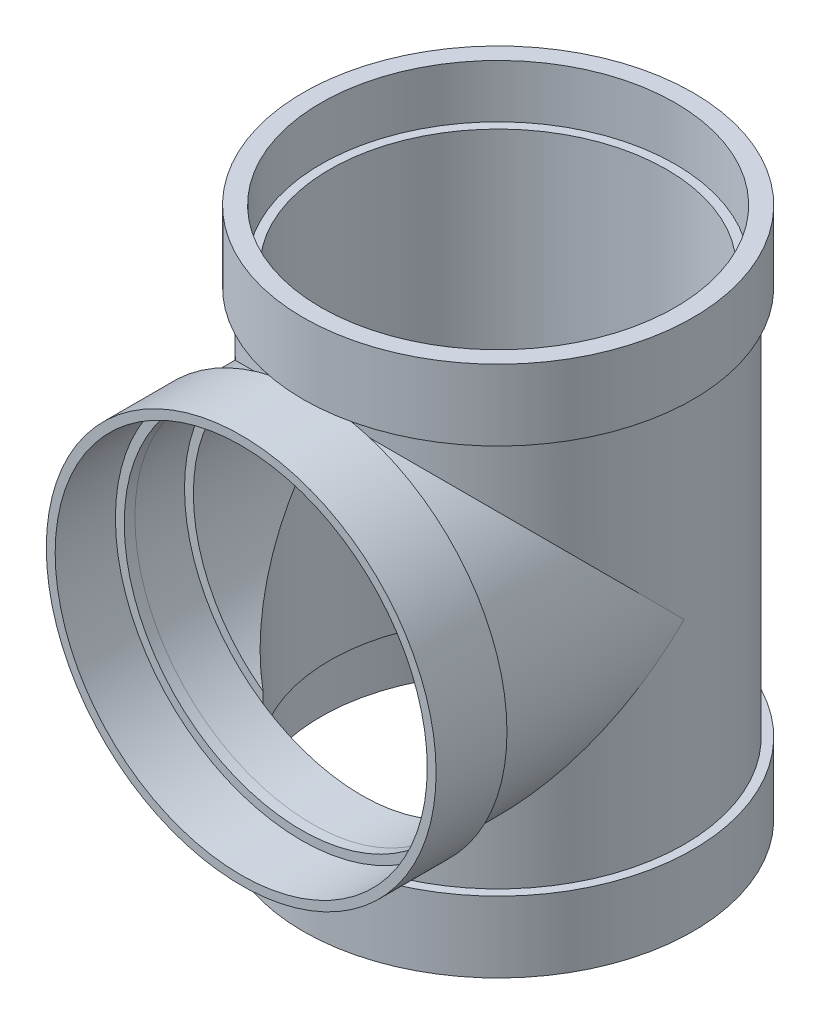
ISO-10303-21;
HEADER;
FILE_DESCRIPTION(('STEP AP214'),'2;1');
FILE_NAME('part.step','',(''),(''),'','','');
FILE_SCHEMA(('AUTOMOTIVE_DESIGN { 1 0 10303 214 1 1 1 1 }'));
ENDSEC;
DATA;
#1=APPLICATION_CONTEXT('core data for automotive mechanical design processes');
#2=APPLICATION_PROTOCOL_DEFINITION('international standard','automotive_design',2000,#1);
#3=PRODUCT_CONTEXT('',#1,'mechanical');
#4=PRODUCT('Part','Part','',(#3));
#5=PRODUCT_RELATED_PRODUCT_CATEGORY('part','',(#4));
#6=PRODUCT_DEFINITION_FORMATION('','',#4);
#7=PRODUCT_DEFINITION_CONTEXT('part definition',#1,'design');
#8=PRODUCT_DEFINITION('design','',#6,#7);
#9=PRODUCT_DEFINITION_SHAPE('','',#8);
#10=(LENGTH_UNIT() NAMED_UNIT(*) SI_UNIT(.MILLI.,.METRE.));
#11=(NAMED_UNIT(*) PLANE_ANGLE_UNIT() SI_UNIT($,.RADIAN.));
#12=(NAMED_UNIT(*) SI_UNIT($,.STERADIAN.) SOLID_ANGLE_UNIT());
#13=UNCERTAINTY_MEASURE_WITH_UNIT(LENGTH_MEASURE(1.E-05),#10,'distance_accuracy_value','');
#14=(GEOMETRIC_REPRESENTATION_CONTEXT(3) GLOBAL_UNCERTAINTY_ASSIGNED_CONTEXT((#13)) GLOBAL_UNIT_ASSIGNED_CONTEXT((#10,
#11,#12)) REPRESENTATION_CONTEXT('',''));
#15=CARTESIAN_POINT('',(0.,0.,0.));
#16=DIRECTION('',(0.,0.,1.));
#17=DIRECTION('',(1.,0.,0.));
#18=AXIS2_PLACEMENT_3D('',#15,#16,#17);
#19=CARTESIAN_POINT('',(0.,55.,72.5));
#20=DIRECTION('',(0.,0.,-1.));
#21=DIRECTION('',(-1.,0.,0.));
#22=AXIS2_PLACEMENT_3D('',#19,#20,#21);
#23=CYLINDRICAL_SURFACE('',#22,55.);
#24=CARTESIAN_POINT('',(0.,55.,72.5));
#25=DIRECTION('',(0.,0.,1.));
#26=DIRECTION('',(1.,0.,0.));
#27=AXIS2_PLACEMENT_3D('',#24,#25,#26);
#28=CIRCLE('',#27,55.);
#29=CARTESIAN_POINT('',(55.,55.,72.5));
#30=VERTEX_POINT('',#29);
#31=EDGE_CURVE('E11',#30,#30,#28,.T.);
#32=ORIENTED_EDGE('',*,*,#31,.F.);
#33=EDGE_LOOP('',(#32));
#34=FACE_BOUND('',#33,.T.);
#35=CARTESIAN_POINT('',(0.,55.,52.5));
#36=DIRECTION('',(0.,0.,1.));
#37=DIRECTION('',(1.,0.,0.));
#38=AXIS2_PLACEMENT_3D('',#35,#36,#37);
#39=CIRCLE('',#38,55.);
#40=CARTESIAN_POINT('',(55.,55.,52.5));
#41=VERTEX_POINT('',#40);
#42=EDGE_CURVE('E44',#41,#41,#39,.T.);
#43=ORIENTED_EDGE('',*,*,#42,.T.);
#44=EDGE_LOOP('',(#43));
#45=FACE_BOUND('',#44,.T.);
#46=ADVANCED_FACE('F41',(#34,#45),#23,.T.);
#47=CARTESIAN_POINT('',(0.,55.,72.5));
#48=DIRECTION('',(0.,0.,1.));
#49=DIRECTION('',(1.,0.,0.));
#50=AXIS2_PLACEMENT_3D('',#47,#48,#49);
#51=PLANE('',#50);
#52=CARTESIAN_POINT('',(0.,55.,72.5));
#53=DIRECTION('',(0.,0.,1.));
#54=DIRECTION('',(1.,0.,0.));
#55=AXIS2_PLACEMENT_3D('',#52,#53,#54);
#56=CIRCLE('',#55,52.5);
#57=CARTESIAN_POINT('',(52.5,55.,72.5));
#58=VERTEX_POINT('',#57);
#59=EDGE_CURVE('E53',#58,#58,#56,.T.);
#60=ORIENTED_EDGE('',*,*,#59,.F.);
#61=EDGE_LOOP('',(#60));
#62=FACE_BOUND('',#61,.T.);
#63=ORIENTED_EDGE('',*,*,#31,.T.);
#64=EDGE_LOOP('',(#63));
#65=FACE_BOUND('',#64,.T.);
#66=ADVANCED_FACE('F81',(#62,#65),#51,.T.);
#67=CARTESIAN_POINT('',(0.,55.,52.5));
#68=DIRECTION('',(0.,0.,1.));
#69=DIRECTION('',(1.,0.,0.));
#70=AXIS2_PLACEMENT_3D('',#67,#68,#69);
#71=PLANE('',#70);
#72=CARTESIAN_POINT('',(0.,55.,52.5));
#73=DIRECTION('',(0.,0.,1.));
#74=DIRECTION('',(1.,0.,0.));
#75=AXIS2_PLACEMENT_3D('',#72,#73,#74);
#76=CIRCLE('',#75,50.);
#77=CARTESIAN_POINT('',(50.,55.,52.5));
#78=VERTEX_POINT('',#77);
#79=EDGE_CURVE('E56',#78,#78,#76,.T.);
#80=ORIENTED_EDGE('',*,*,#79,.T.);
#81=EDGE_LOOP('',(#80));
#82=FACE_BOUND('',#81,.T.);
#83=ORIENTED_EDGE('',*,*,#42,.F.);
#84=EDGE_LOOP('',(#83));
#85=FACE_BOUND('',#84,.T.);
#86=ADVANCED_FACE('F77',(#82,#85),#71,.F.);
#87=CARTESIAN_POINT('',(0.,55.,55.5));
#88=DIRECTION('',(0.,0.,1.));
#89=DIRECTION('',(1.,0.,0.));
#90=AXIS2_PLACEMENT_3D('',#87,#88,#89);
#91=CYLINDRICAL_SURFACE('',#90,52.5);
#92=CARTESIAN_POINT('',(0.,55.,55.5));
#93=DIRECTION('',(0.,0.,1.));
#94=DIRECTION('',(1.,0.,0.));
#95=AXIS2_PLACEMENT_3D('',#92,#93,#94);
#96=CIRCLE('',#95,52.5);
#97=CARTESIAN_POINT('',(52.5,55.,55.5));
#98=VERTEX_POINT('',#97);
#99=EDGE_CURVE('E51',#98,#98,#96,.T.);
#100=ORIENTED_EDGE('',*,*,#99,.F.);
#101=EDGE_LOOP('',(#100));
#102=FACE_BOUND('',#101,.T.);
#103=ORIENTED_EDGE('',*,*,#59,.T.);
#104=EDGE_LOOP('',(#103));
#105=FACE_BOUND('',#104,.T.);
#106=ADVANCED_FACE('F71',(#102,#105),#91,.F.);
#107=CARTESIAN_POINT('',(0.,55.,55.5));
#108=DIRECTION('',(0.,0.,1.));
#109=DIRECTION('',(1.,0.,0.));
#110=AXIS2_PLACEMENT_3D('',#107,#108,#109);
#111=PLANE('',#110);
#112=CARTESIAN_POINT('',(0.,55.,55.5));
#113=DIRECTION('',(0.,0.,1.));
#114=DIRECTION('',(1.,0.,0.));
#115=AXIS2_PLACEMENT_3D('',#112,#113,#114);
#116=CIRCLE('',#115,50.);
#117=CARTESIAN_POINT('',(50.,55.,55.5));
#118=VERTEX_POINT('',#117);
#119=EDGE_CURVE('E61',#118,#118,#116,.T.);
#120=ORIENTED_EDGE('',*,*,#119,.F.);
#121=EDGE_LOOP('',(#120));
#122=FACE_BOUND('',#121,.T.);
#123=ORIENTED_EDGE('',*,*,#99,.T.);
#124=EDGE_LOOP('',(#123));
#125=FACE_BOUND('',#124,.T.);
#126=ADVANCED_FACE('F68',(#122,#125),#111,.T.);
#127=CARTESIAN_POINT('',(0.,55.,38.5));
#128=DIRECTION('',(0.,0.,1.));
#129=DIRECTION('',(1.,0.,0.));
#130=AXIS2_PLACEMENT_3D('',#127,#128,#129);
#131=CYLINDRICAL_SURFACE('',#130,50.);
#132=ORIENTED_EDGE('',*,*,#119,.T.);
#133=EDGE_LOOP('',(#132));
#134=FACE_BOUND('',#133,.T.);
#135=ORIENTED_EDGE('',*,*,#79,.F.);
#136=EDGE_LOOP('',(#135));
#137=FACE_BOUND('',#136,.T.);
#138=ADVANCED_FACE('F65',(#134,#137),#131,.F.);
#139=CLOSED_SHELL('',(#46,#66,#86,#106,#126,#138));
#140=MANIFOLD_SOLID_BREP('B2',#139);
#141=CARTESIAN_POINT('',(0.,55.,38.5));
#142=DIRECTION('',(0.,0.,1.));
#143=DIRECTION('',(1.,0.,0.));
#144=AXIS2_PLACEMENT_3D('',#141,#142,#143);
#145=PLANE('',#144);
#146=CARTESIAN_POINT('',(0.,55.,38.5));
#147=DIRECTION('',(0.,0.,1.));
#148=DIRECTION('',(1.,0.,0.));
#149=AXIS2_PLACEMENT_3D('',#146,#147,#148);
#150=CIRCLE('',#149,47.5);
#151=CARTESIAN_POINT('',(27.8208554864871,93.5,38.5));
#152=VERTEX_POINT('',#151);
#153=CARTESIAN_POINT('',(27.8208554864871,16.5,38.5));
#154=VERTEX_POINT('',#153);
#155=EDGE_CURVE('E220',#152,#154,#150,.F.);
#156=ORIENTED_EDGE('',*,*,#155,.T.);
#157=DIRECTION('',(0.,-1.,0.));
#158=VECTOR('',#157,1.);
#159=CARTESIAN_POINT('',(27.8208554864871,110.,38.5));
#160=LINE('',#159,#158);
#161=CARTESIAN_POINT('',(27.8208554864871,13.454843844318,38.5));
#162=VERTEX_POINT('',#161);
#163=EDGE_CURVE('E214',#154,#162,#160,.T.);
#164=ORIENTED_EDGE('',*,*,#163,.T.);
#165=CARTESIAN_POINT('',(0.,55.,38.5));
#166=DIRECTION('',(0.,0.,1.));
#167=DIRECTION('',(1.,0.,0.));
#168=AXIS2_PLACEMENT_3D('',#165,#166,#167);
#169=CIRCLE('',#168,50.);
#170=CARTESIAN_POINT('',(27.8208554864871,96.545156155682,38.5));
#171=VERTEX_POINT('',#170);
#172=EDGE_CURVE('E355',#162,#171,#169,.T.);
#173=ORIENTED_EDGE('',*,*,#172,.T.);
#174=EDGE_CURVE('E39',#171,#152,#160,.T.);
#175=ORIENTED_EDGE('',*,*,#174,.T.);
#176=EDGE_LOOP('',(#156,#164,#173,#175));
#177=FACE_BOUND('',#176,.T.);
#178=ADVANCED_FACE('F133',(#177),#145,.T.);
#179=CARTESIAN_POINT('',(-27.8208554864871,96.545156155682,38.5));
#180=VERTEX_POINT('',#179);
#181=CARTESIAN_POINT('',(-27.8208554864871,13.454843844318,38.5));
#182=VERTEX_POINT('',#181);
#183=EDGE_CURVE('E360',#180,#182,#169,.T.);
#184=ORIENTED_EDGE('',*,*,#183,.T.);
#185=DIRECTION('',(0.,-1.,0.));
#186=VECTOR('',#185,1.);
#187=CARTESIAN_POINT('',(-27.8208554864871,110.,38.5));
#188=LINE('',#187,#186);
#189=CARTESIAN_POINT('',(-27.8208554864871,16.5,38.5));
#190=VERTEX_POINT('',#189);
#191=EDGE_CURVE('E142',#182,#190,#188,.F.);
#192=ORIENTED_EDGE('',*,*,#191,.T.);
#193=CARTESIAN_POINT('',(0.,55.,38.5));
#194=DIRECTION('',(0.,0.,1.));
#195=DIRECTION('',(1.,0.,0.));
#196=AXIS2_PLACEMENT_3D('',#193,#194,#195);
#197=CIRCLE('',#196,47.5);
#198=CARTESIAN_POINT('',(-27.8208554864871,93.5,38.5));
#199=VERTEX_POINT('',#198);
#200=EDGE_CURVE('E221',#190,#199,#197,.F.);
#201=ORIENTED_EDGE('',*,*,#200,.T.);
#202=EDGE_CURVE('E250',#199,#180,#188,.F.);
#203=ORIENTED_EDGE('',*,*,#202,.T.);
#204=EDGE_LOOP('',(#184,#192,#201,#203));
#205=FACE_BOUND('',#204,.T.);
#206=ADVANCED_FACE('F283',(#205),#145,.T.);
#207=CARTESIAN_POINT('',(0.,110.,0.));
#208=DIRECTION('',(0.,-1.,0.));
#209=DIRECTION('',(0.,0.,-1.));
#210=AXIS2_PLACEMENT_3D('',#207,#208,#209);
#211=CYLINDRICAL_SURFACE('',#210,52.5);
#212=CARTESIAN_POINT('',(0.,110.,0.));
#213=DIRECTION('',(0.,1.,0.));
#214=DIRECTION('',(0.,0.,1.));
#215=AXIS2_PLACEMENT_3D('',#212,#213,#214);
#216=CIRCLE('',#215,52.5);
#217=CARTESIAN_POINT('',(0.,110.,52.5));
#218=VERTEX_POINT('',#217);
#219=EDGE_CURVE('E335',#218,#218,#216,.T.);
#220=ORIENTED_EDGE('',*,*,#219,.F.);
#221=EDGE_LOOP('',(#220));
#222=FACE_BOUND('',#221,.T.);
#223=CARTESIAN_POINT('',(0.,0.,0.));
#224=DIRECTION('',(0.,-1.,0.));
#225=DIRECTION('',(0.,0.,-1.));
#226=AXIS2_PLACEMENT_3D('',#223,#224,#225);
#227=CIRCLE('',#226,52.5);
#228=CARTESIAN_POINT('',(0.,0.,-52.5));
#229=VERTEX_POINT('',#228);
#230=EDGE_CURVE('E373',#229,#229,#227,.T.);
#231=ORIENTED_EDGE('',*,*,#230,.F.);
#232=EDGE_LOOP('',(#231));
#233=FACE_BOUND('',#232,.T.);
#234=CARTESIAN_POINT('',(0.,55.,0.));
#235=DIRECTION('',(0.,-0.707106781186547,0.707106781186547));
#236=DIRECTION('',(0.,-0.707106781186547,-0.707106781186547));
#237=AXIS2_PLACEMENT_3D('',#234,#235,#236);
#238=ELLIPSE('',#237,74.2462120245875,52.5);
#239=CARTESIAN_POINT('',(52.5,55.,0.));
#240=VERTEX_POINT('',#239);
#241=CARTESIAN_POINT('',(0.,107.5,52.5));
#242=VERTEX_POINT('',#241);
#243=EDGE_CURVE('E337',#240,#242,#238,.T.);
#244=ORIENTED_EDGE('',*,*,#243,.F.);
#245=CARTESIAN_POINT('',(0.,55.,0.));
#246=DIRECTION('',(0.,-0.707106781186547,-0.707106781186547));
#247=DIRECTION('',(0.,-0.707106781186547,0.707106781186547));
#248=AXIS2_PLACEMENT_3D('',#245,#246,#247);
#249=ELLIPSE('',#248,74.2462120245875,52.5);
#250=CARTESIAN_POINT('',(0.,2.5,52.5));
#251=VERTEX_POINT('',#250);
#252=EDGE_CURVE('E160',#251,#240,#249,.F.);
#253=ORIENTED_EDGE('',*,*,#252,.F.);
#254=CARTESIAN_POINT('',(-52.5,55.,0.));
#255=VERTEX_POINT('',#254);
#256=EDGE_CURVE('E330',#255,#251,#249,.F.);
#257=ORIENTED_EDGE('',*,*,#256,.F.);
#258=EDGE_CURVE('E329',#242,#255,#238,.T.);
#259=ORIENTED_EDGE('',*,*,#258,.F.);
#260=EDGE_LOOP('',(#244,#253,#257,#259));
#261=FACE_BOUND('',#260,.T.);
#262=ADVANCED_FACE('F135',(#222,#233,#261),#211,.T.);
#263=CARTESIAN_POINT('',(0.,55.,52.5));
#264=DIRECTION('',(0.,0.,-1.));
#265=DIRECTION('',(-1.,0.,0.));
#266=AXIS2_PLACEMENT_3D('',#263,#264,#265);
#267=CYLINDRICAL_SURFACE('',#266,52.5);
#268=ORIENTED_EDGE('',*,*,#258,.T.);
#269=ORIENTED_EDGE('',*,*,#256,.T.);
#270=CARTESIAN_POINT('',(0.,55.,52.5));
#271=DIRECTION('',(0.,0.,1.));
#272=DIRECTION('',(1.,0.,0.));
#273=AXIS2_PLACEMENT_3D('',#270,#271,#272);
#274=CIRCLE('',#273,52.5);
#275=EDGE_CURVE('E333',#242,#251,#274,.T.);
#276=ORIENTED_EDGE('',*,*,#275,.F.);
#277=EDGE_LOOP('',(#268,#269,#276));
#278=FACE_BOUND('',#277,.T.);
#279=ADVANCED_FACE('F318',(#278),#267,.T.);
#280=EDGE_CURVE('E378',#251,#242,#274,.T.);
#281=ORIENTED_EDGE('',*,*,#280,.F.);
#282=ORIENTED_EDGE('',*,*,#252,.T.);
#283=ORIENTED_EDGE('',*,*,#243,.T.);
#284=EDGE_LOOP('',(#281,#282,#283));
#285=FACE_BOUND('',#284,.T.);
#286=ADVANCED_FACE('F316',(#285),#267,.T.);
#287=CARTESIAN_POINT('',(0.,55.,52.5));
#288=DIRECTION('',(0.,0.,1.));
#289=DIRECTION('',(1.,0.,0.));
#290=AXIS2_PLACEMENT_3D('',#287,#288,#289);
#291=PLANE('',#290);
#292=CARTESIAN_POINT('',(0.,55.,52.5));
#293=DIRECTION('',(0.,0.,1.));
#294=DIRECTION('',(1.,0.,0.));
#295=AXIS2_PLACEMENT_3D('',#292,#293,#294);
#296=CIRCLE('',#295,50.);
#297=CARTESIAN_POINT('',(50.,55.,52.5));
#298=VERTEX_POINT('',#297);
#299=EDGE_CURVE('E137',#298,#298,#296,.T.);
#300=ORIENTED_EDGE('',*,*,#299,.F.);
#301=EDGE_LOOP('',(#300));
#302=FACE_BOUND('',#301,.T.);
#303=ORIENTED_EDGE('',*,*,#275,.T.);
#304=ORIENTED_EDGE('',*,*,#280,.T.);
#305=EDGE_LOOP('',(#303,#304));
#306=FACE_BOUND('',#305,.T.);
#307=ADVANCED_FACE('F310',(#302,#306),#291,.T.);
#308=CARTESIAN_POINT('',(0.,0.,0.));
#309=DIRECTION('',(0.,-1.,0.));
#310=DIRECTION('',(0.,0.,-1.));
#311=AXIS2_PLACEMENT_3D('',#308,#309,#310);
#312=PLANE('',#311);
#313=CARTESIAN_POINT('',(0.,0.,0.));
#314=DIRECTION('',(0.,-1.,0.));
#315=DIRECTION('',(0.,0.,-1.));
#316=AXIS2_PLACEMENT_3D('',#313,#314,#315);
#317=CIRCLE('',#316,55.);
#318=CARTESIAN_POINT('',(0.,0.,-55.));
#319=VERTEX_POINT('',#318);
#320=EDGE_CURVE('E367',#319,#319,#317,.T.);
#321=ORIENTED_EDGE('',*,*,#320,.F.);
#322=EDGE_LOOP('',(#321));
#323=FACE_BOUND('',#322,.T.);
#324=ORIENTED_EDGE('',*,*,#230,.T.);
#325=EDGE_LOOP('',(#324));
#326=FACE_BOUND('',#325,.T.);
#327=ADVANCED_FACE('F307',(#323,#326),#312,.F.);
#328=CARTESIAN_POINT('',(0.,-20.,0.));
#329=DIRECTION('',(0.,1.,0.));
#330=DIRECTION('',(0.,0.,1.));
#331=AXIS2_PLACEMENT_3D('',#328,#329,#330);
#332=CYLINDRICAL_SURFACE('',#331,55.);
#333=CARTESIAN_POINT('',(0.,-20.,0.));
#334=DIRECTION('',(0.,-1.,0.));
#335=DIRECTION('',(0.,0.,-1.));
#336=AXIS2_PLACEMENT_3D('',#333,#334,#335);
#337=CIRCLE('',#336,55.);
#338=CARTESIAN_POINT('',(0.,-20.,-55.));
#339=VERTEX_POINT('',#338);
#340=EDGE_CURVE('E370',#339,#339,#337,.T.);
#341=ORIENTED_EDGE('',*,*,#340,.F.);
#342=EDGE_LOOP('',(#341));
#343=FACE_BOUND('',#342,.T.);
#344=ORIENTED_EDGE('',*,*,#320,.T.);
#345=EDGE_LOOP('',(#344));
#346=FACE_BOUND('',#345,.T.);
#347=ADVANCED_FACE('F305',(#343,#346),#332,.T.);
#348=CARTESIAN_POINT('',(0.,-20.,0.));
#349=DIRECTION('',(0.,-1.,0.));
#350=DIRECTION('',(0.,0.,-1.));
#351=AXIS2_PLACEMENT_3D('',#348,#349,#350);
#352=PLANE('',#351);
#353=CARTESIAN_POINT('',(0.,-20.,0.));
#354=DIRECTION('',(0.,-1.,0.));
#355=DIRECTION('',(0.,0.,-1.));
#356=AXIS2_PLACEMENT_3D('',#353,#354,#355);
#357=CIRCLE('',#356,50.);
#358=CARTESIAN_POINT('',(0.,-20.,-50.));
#359=VERTEX_POINT('',#358);
#360=EDGE_CURVE('E236',#359,#359,#357,.T.);
#361=ORIENTED_EDGE('',*,*,#360,.F.);
#362=EDGE_LOOP('',(#361));
#363=FACE_BOUND('',#362,.T.);
#364=ORIENTED_EDGE('',*,*,#340,.T.);
#365=EDGE_LOOP('',(#364));
#366=FACE_BOUND('',#365,.T.);
#367=ADVANCED_FACE('F298',(#363,#366),#352,.T.);
#368=CARTESIAN_POINT('',(0.,110.,0.));
#369=DIRECTION('',(0.,1.,0.));
#370=DIRECTION('',(0.,0.,1.));
#371=AXIS2_PLACEMENT_3D('',#368,#369,#370);
#372=PLANE('',#371);
#373=CARTESIAN_POINT('',(0.,110.,0.));
#374=DIRECTION('',(0.,1.,0.));
#375=DIRECTION('',(0.,0.,1.));
#376=AXIS2_PLACEMENT_3D('',#373,#374,#375);
#377=CIRCLE('',#376,55.);
#378=CARTESIAN_POINT('',(0.,110.,55.));
#379=VERTEX_POINT('',#378);
#380=EDGE_CURVE('E362',#379,#379,#377,.T.);
#381=ORIENTED_EDGE('',*,*,#380,.F.);
#382=EDGE_LOOP('',(#381));
#383=FACE_BOUND('',#382,.T.);
#384=ORIENTED_EDGE('',*,*,#219,.T.);
#385=EDGE_LOOP('',(#384));
#386=FACE_BOUND('',#385,.T.);
#387=ADVANCED_FACE('F295',(#383,#386),#372,.F.);
#388=CARTESIAN_POINT('',(0.,130.,0.));
#389=DIRECTION('',(0.,-1.,0.));
#390=DIRECTION('',(0.,0.,-1.));
#391=AXIS2_PLACEMENT_3D('',#388,#389,#390);
#392=CYLINDRICAL_SURFACE('',#391,55.);
#393=CARTESIAN_POINT('',(0.,130.,0.));
#394=DIRECTION('',(0.,1.,0.));
#395=DIRECTION('',(0.,0.,1.));
#396=AXIS2_PLACEMENT_3D('',#393,#394,#395);
#397=CIRCLE('',#396,55.);
#398=CARTESIAN_POINT('',(0.,130.,55.));
#399=VERTEX_POINT('',#398);
#400=EDGE_CURVE('E364',#399,#399,#397,.T.);
#401=ORIENTED_EDGE('',*,*,#400,.F.);
#402=EDGE_LOOP('',(#401));
#403=FACE_BOUND('',#402,.T.);
#404=ORIENTED_EDGE('',*,*,#380,.T.);
#405=EDGE_LOOP('',(#404));
#406=FACE_BOUND('',#405,.T.);
#407=ADVANCED_FACE('F293',(#403,#406),#392,.T.);
#408=CARTESIAN_POINT('',(0.,130.,0.));
#409=DIRECTION('',(0.,1.,0.));
#410=DIRECTION('',(0.,0.,1.));
#411=AXIS2_PLACEMENT_3D('',#408,#409,#410);
#412=PLANE('',#411);
#413=CARTESIAN_POINT('',(0.,130.,0.));
#414=DIRECTION('',(0.,1.,0.));
#415=DIRECTION('',(0.,0.,1.));
#416=AXIS2_PLACEMENT_3D('',#413,#414,#415);
#417=CIRCLE('',#416,50.);
#418=CARTESIAN_POINT('',(0.,130.,50.));
#419=VERTEX_POINT('',#418);
#420=EDGE_CURVE('E237',#419,#419,#417,.T.);
#421=ORIENTED_EDGE('',*,*,#420,.F.);
#422=EDGE_LOOP('',(#421));
#423=FACE_BOUND('',#422,.T.);
#424=ORIENTED_EDGE('',*,*,#400,.T.);
#425=EDGE_LOOP('',(#424));
#426=FACE_BOUND('',#425,.T.);
#427=ADVANCED_FACE('F289',(#423,#426),#412,.T.);
#428=CARTESIAN_POINT('',(0.,55.,38.5));
#429=DIRECTION('',(0.,0.,1.));
#430=DIRECTION('',(1.,0.,0.));
#431=AXIS2_PLACEMENT_3D('',#428,#429,#430);
#432=CYLINDRICAL_SURFACE('',#431,50.);
#433=ORIENTED_EDGE('',*,*,#299,.T.);
#434=EDGE_LOOP('',(#433));
#435=FACE_BOUND('',#434,.T.);
#436=EDGE_CURVE('E353',#171,#180,#169,.T.);
#437=ORIENTED_EDGE('',*,*,#436,.F.);
#438=ORIENTED_EDGE('',*,*,#172,.F.);
#439=EDGE_CURVE('E358',#182,#162,#169,.T.);
#440=ORIENTED_EDGE('',*,*,#439,.F.);
#441=ORIENTED_EDGE('',*,*,#183,.F.);
#442=EDGE_LOOP('',(#437,#438,#440,#441));
#443=FACE_BOUND('',#442,.T.);
#444=ADVANCED_FACE('F285',(#435,#443),#432,.F.);
#445=CARTESIAN_POINT('',(0.,55.,38.5));
#446=DIRECTION('',(0.,0.,1.));
#447=DIRECTION('',(1.,0.,0.));
#448=AXIS2_PLACEMENT_3D('',#445,#446,#447);
#449=PLANE('',#448);
#450=ORIENTED_EDGE('',*,*,#436,.T.);
#451=CARTESIAN_POINT('',(-27.8208554864871,102.444704657106,38.5));
#452=VERTEX_POINT('',#451);
#453=EDGE_CURVE('E254',#180,#452,#188,.F.);
#454=ORIENTED_EDGE('',*,*,#453,.T.);
#455=CARTESIAN_POINT('',(0.,55.,38.5));
#456=DIRECTION('',(0.,0.,1.));
#457=DIRECTION('',(1.,0.,0.));
#458=AXIS2_PLACEMENT_3D('',#455,#456,#457);
#459=CIRCLE('',#458,55.);
#460=CARTESIAN_POINT('',(27.8208554864871,102.444704657106,38.5));
#461=VERTEX_POINT('',#460);
#462=EDGE_CURVE('E241',#461,#452,#459,.T.);
#463=ORIENTED_EDGE('',*,*,#462,.F.);
#464=EDGE_CURVE('E144',#461,#171,#160,.T.);
#465=ORIENTED_EDGE('',*,*,#464,.T.);
#466=EDGE_LOOP('',(#450,#454,#463,#465));
#467=FACE_BOUND('',#466,.T.);
#468=ADVANCED_FACE('F288',(#467),#449,.F.);
#469=CARTESIAN_POINT('',(0.,55.,38.5));
#470=DIRECTION('',(0.,0.,1.));
#471=DIRECTION('',(1.,0.,0.));
#472=AXIS2_PLACEMENT_3D('',#469,#470,#471);
#473=CYLINDRICAL_SURFACE('',#472,55.);
#474=CARTESIAN_POINT('',(-27.8208554864871,102.444704657106,38.5));
#475=CARTESIAN_POINT('',(-27.3831317202294,102.701377824027,38.8163015640361));
#476=CARTESIAN_POINT('',(-26.9384809595202,102.953974033596,39.1262571082015));
#477=CARTESIAN_POINT('',(-26.0353274853613,103.450256261897,39.7329568042095));
#478=CARTESIAN_POINT('',(-25.5768232726919,103.69394130991,40.0296995175024));
#479=CARTESIAN_POINT('',(-24.1799444987851,104.41078924167,40.8996852081971));
#480=CARTESIAN_POINT('',(-23.2208943192272,104.869337604785,41.4521851051786));
#481=CARTESIAN_POINT('',(-21.2425740185333,105.74378306232,42.5001826672834));
#482=CARTESIAN_POINT('',(-20.2229002918246,106.159328075482,42.995213297464));
#483=CARTESIAN_POINT('',(-18.1337327056255,106.936591849617,43.9172064435102));
#484=CARTESIAN_POINT('',(-17.0642532101844,107.29832600502,44.3441884295152));
#485=CARTESIAN_POINT('',(-14.8729842984927,107.963314208691,45.1265492611649));
#486=CARTESIAN_POINT('',(-13.7509022785109,108.266176506637,45.4814491080113));
#487=CARTESIAN_POINT('',(-12.0391760954045,108.669382923022,45.9527931676162));
#488=CARTESIAN_POINT('',(-11.4637082653337,108.795291865292,46.0997649630494));
#489=CARTESIAN_POINT('',(-10.3042664347671,109.029358737048,46.3726918957953));
#490=CARTESIAN_POINT('',(-9.72029352950572,109.137518930491,46.4986497135981));
#491=CARTESIAN_POINT('',(-8.54710830984001,109.335067625729,46.7285031672942));
#492=CARTESIAN_POINT('',(-7.95792218156339,109.424521838103,46.8324760470141));
#493=CARTESIAN_POINT('',(-6.77361170746317,109.58456910978,47.0183732260939));
#494=CARTESIAN_POINT('',(-6.17848812941148,109.65516457574,47.100300338832));
#495=CARTESIAN_POINT('',(-4.98363296023795,109.777038421355,47.241668332568));
#496=CARTESIAN_POINT('',(-4.38390167059938,109.828318054048,47.3011106721769));
#497=CARTESIAN_POINT('',(-3.18132250473874,109.911225334666,47.3971859501205));
#498=CARTESIAN_POINT('',(-2.5784747257534,109.942853592041,47.4338195958237));
#499=CARTESIAN_POINT('',(-0.907500565962405,110.002869262849,47.5033290414562));
#500=CARTESIAN_POINT('',(0.162586942730473,110.010135247604,47.511737642622));
#501=CARTESIAN_POINT('',(2.29926272608862,109.96231264788,47.4563585588434));
#502=CARTESIAN_POINT('',(3.36585126120976,109.907228815295,47.3925763758052));
#503=CARTESIAN_POINT('',(5.48821591921209,109.735853479525,47.1939210483369));
#504=CARTESIAN_POINT('',(6.5439834861984,109.619516857665,47.0589954997471));
#505=CARTESIAN_POINT('',(8.63611255628125,109.328014936974,46.7203448911041));
#506=CARTESIAN_POINT('',(9.67247408761328,109.152849723746,46.5166199311612));
#507=CARTESIAN_POINT('',(11.6762032472374,108.755610796647,46.0535474009082));
#508=CARTESIAN_POINT('',(12.6446445665327,108.535802103291,45.796878675086));
#509=CARTESIAN_POINT('',(14.5524769708595,108.048983772001,45.2268357079356));
#510=CARTESIAN_POINT('',(15.4918677637361,107.781973659553,44.9134608965437));
#511=CARTESIAN_POINT('',(17.3378688726481,107.204732130435,44.2336556728304));
#512=CARTESIAN_POINT('',(18.2444678347377,106.894485920627,43.8672070997428));
#513=CARTESIAN_POINT('',(20.0214475765377,106.235139879964,43.0851920492494));
#514=CARTESIAN_POINT('',(20.8918331717337,105.886045237826,42.6696321308484));
#515=CARTESIAN_POINT('',(22.281966842903,105.287756861522,41.9539228589597));
#516=CARTESIAN_POINT('',(22.8132468563679,105.048875662344,41.6673369762774));
#517=CARTESIAN_POINT('',(23.8600111798779,104.558388050237,41.0768893135815));
#518=CARTESIAN_POINT('',(24.3754976548103,104.306783394011,40.7730299177742));
#519=CARTESIAN_POINT('',(25.3886717909191,103.792795825822,40.1499423657334));
#520=CARTESIAN_POINT('',(25.886414487898,103.530452887678,39.8307705610548));
#521=CARTESIAN_POINT('',(26.8657781468364,102.995223345304,39.1768630715541));
#522=CARTESIAN_POINT('',(27.3473986283106,102.722336427356,38.8421269235817));
#523=CARTESIAN_POINT('',(27.8208554864871,102.444704657106,38.5));
#524=B_SPLINE_CURVE_WITH_KNOTS('',3,(#474,#475,#476,#477,#478,#479,#480,#481,#482,#483,#484,
#485,#486,#487,#488,#489,#490,#491,#492,#493,#494,#495,#496,#497,#498,#499,#500,#501,#502,#503,
#504,#505,#506,#507,#508,#509,#510,#511,#512,#513,#514,#515,#516,#517,#518,#519,#520,#521,#522,
#523),.UNSPECIFIED.,.F.,.F.,(4,2,2,2,2,2,2,2,2,2,2,2,2,2,2,2,2,2,2,2,2,2,2,2,4),(0.,
1.79364134133391,3.58747749061408,7.17797871198753,10.7958723344369,14.4127289362379,
18.0528858858792,19.8737378619079,21.6943573967733,23.5084698216805,25.322350628078,
27.1361137459184,28.9498206105349,32.155661594752,35.3612582673245,38.5692194858614,
41.7771760365007,44.8511343690218,47.9251236056194,51.0001671951128,54.0748005640855,
56.0218904765842,57.9687122881315,59.9088496043192,61.8490446904185),.UNSPECIFIED.);
#525=EDGE_CURVE('E262',#452,#461,#524,.T.);
#526=ORIENTED_EDGE('',*,*,#525,.T.);
#527=ORIENTED_EDGE('',*,*,#462,.T.);
#528=EDGE_LOOP('',(#526,#527));
#529=FACE_BOUND('',#528,.T.);
#530=ADVANCED_FACE('F278',(#529),#473,.T.);
#531=CARTESIAN_POINT('',(0.,110.,0.));
#532=DIRECTION('',(0.,-1.,0.));
#533=DIRECTION('',(0.,0.,-1.));
#534=AXIS2_PLACEMENT_3D('',#531,#532,#533);
#535=CYLINDRICAL_SURFACE('',#534,47.5);
#536=CARTESIAN_POINT('',(0.,115.,0.));
#537=DIRECTION('',(0.,1.,0.));
#538=DIRECTION('',(0.,0.,1.));
#539=AXIS2_PLACEMENT_3D('',#536,#537,#538);
#540=CIRCLE('',#539,47.5);
#541=CARTESIAN_POINT('',(0.,115.,47.5));
#542=VERTEX_POINT('',#541);
#543=EDGE_CURVE('E232',#542,#542,#540,.T.);
#544=ORIENTED_EDGE('',*,*,#543,.T.);
#545=EDGE_LOOP('',(#544));
#546=FACE_BOUND('',#545,.T.);
#547=CARTESIAN_POINT('',(0.,-5.,0.));
#548=DIRECTION('',(0.,-1.,0.));
#549=DIRECTION('',(0.,0.,-1.));
#550=AXIS2_PLACEMENT_3D('',#547,#548,#549);
#551=CIRCLE('',#550,47.5);
#552=CARTESIAN_POINT('',(0.,-5.,-47.5));
#553=VERTEX_POINT('',#552);
#554=EDGE_CURVE('E228',#553,#553,#551,.T.);
#555=ORIENTED_EDGE('',*,*,#554,.T.);
#556=EDGE_LOOP('',(#555));
#557=FACE_BOUND('',#556,.T.);
#558=ORIENTED_EDGE('',*,*,#202,.F.);
#559=CARTESIAN_POINT('',(0.,55.,0.));
#560=DIRECTION('',(0.,-0.707106781186547,0.707106781186547));
#561=DIRECTION('',(0.,-0.707106781186547,-0.707106781186547));
#562=AXIS2_PLACEMENT_3D('',#559,#560,#561);
#563=ELLIPSE('',#562,67.175144212722,47.5);
#564=CARTESIAN_POINT('',(-47.5,55.,0.));
#565=VERTEX_POINT('',#564);
#566=EDGE_CURVE('E152',#199,#565,#563,.T.);
#567=ORIENTED_EDGE('',*,*,#566,.T.);
#568=CARTESIAN_POINT('',(0.,55.,0.));
#569=DIRECTION('',(0.,-0.707106781186547,-0.707106781186547));
#570=DIRECTION('',(0.,-0.707106781186547,0.707106781186547));
#571=AXIS2_PLACEMENT_3D('',#568,#569,#570);
#572=ELLIPSE('',#571,67.175144212722,47.5);
#573=EDGE_CURVE('E217',#565,#190,#572,.F.);
#574=ORIENTED_EDGE('',*,*,#573,.T.);
#575=ORIENTED_EDGE('',*,*,#191,.F.);
#576=CARTESIAN_POINT('',(-27.8208554864871,7.55529534289416,38.5));
#577=VERTEX_POINT('',#576);
#578=EDGE_CURVE('E253',#577,#182,#188,.F.);
#579=ORIENTED_EDGE('',*,*,#578,.F.);
#580=CARTESIAN_POINT('',(27.8208554864871,7.55529534289417,38.5));
#581=CARTESIAN_POINT('',(27.3831317202294,7.29862217597283,38.8163015640361));
#582=CARTESIAN_POINT('',(26.9384809595202,7.04602596640361,39.1262571082015));
#583=CARTESIAN_POINT('',(26.0353274853613,6.54974373810281,39.7329568042095));
#584=CARTESIAN_POINT('',(25.5768232726919,6.30605869008951,40.0296995175024));
#585=CARTESIAN_POINT('',(24.1799444987851,5.58921075832966,40.8996852081971));
#586=CARTESIAN_POINT('',(23.2208943192272,5.13066239521505,41.4521851051786));
#587=CARTESIAN_POINT('',(21.2425740185333,4.25621693768041,42.5001826672834));
#588=CARTESIAN_POINT('',(20.2229002918246,3.8406719245175,42.995213297464));
#589=CARTESIAN_POINT('',(18.1337327056255,3.06340815038292,43.9172064435102));
#590=CARTESIAN_POINT('',(17.0642532101844,2.70167399497991,44.3441884295152));
#591=CARTESIAN_POINT('',(14.8729842984927,2.03668579130872,45.1265492611649));
#592=CARTESIAN_POINT('',(13.7509022785109,1.73382349336251,45.4814491080113));
#593=CARTESIAN_POINT('',(12.0391760954045,1.33061707697765,45.9527931676162));
#594=CARTESIAN_POINT('',(11.4637082653337,1.20470813470767,46.0997649630494));
#595=CARTESIAN_POINT('',(10.3042664347671,0.970641262951931,46.3726918957953));
#596=CARTESIAN_POINT('',(9.72029352950572,0.862481069509471,46.4986497135981));
#597=CARTESIAN_POINT('',(8.54710830984,0.66493237427055,46.7285031672942));
#598=CARTESIAN_POINT('',(7.95792218156339,0.575478161896982,46.8324760470141));
#599=CARTESIAN_POINT('',(6.77361170746317,0.415430890220282,47.0183732260939));
#600=CARTESIAN_POINT('',(6.17848812941147,0.344835424259903,47.100300338832));
#601=CARTESIAN_POINT('',(4.98363296023794,0.222961578644705,47.241668332568));
#602=CARTESIAN_POINT('',(4.38390167059937,0.17168194595223,47.3011106721769));
#603=CARTESIAN_POINT('',(3.18132250473873,0.0887746653342989,47.3971859501205));
#604=CARTESIAN_POINT('',(2.57847472575339,0.0571464079587871,47.4338195958237));
#605=CARTESIAN_POINT('',(0.907500565962394,-0.00286926284916464,47.5033290414562));
#606=CARTESIAN_POINT('',(-0.162586942730483,-0.0101352476035497,47.511737642622));
#607=CARTESIAN_POINT('',(-2.29926272608863,0.0376873521199188,47.4563585588434));
#608=CARTESIAN_POINT('',(-3.36585126120977,0.0927711847051623,47.3925763758052));
#609=CARTESIAN_POINT('',(-5.4882159192121,0.264146520475207,47.1939210483369));
#610=CARTESIAN_POINT('',(-6.54398348619841,0.380483142335309,47.0589954997471));
#611=CARTESIAN_POINT('',(-8.63611255628127,0.671985063025591,46.7203448911041));
#612=CARTESIAN_POINT('',(-9.67247408761329,0.84715027625404,46.5166199311612));
#613=CARTESIAN_POINT('',(-11.6762032472374,1.24438920335271,46.0535474009082));
#614=CARTESIAN_POINT('',(-12.6446445665327,1.4641978967088,45.796878675086));
#615=CARTESIAN_POINT('',(-14.5524769708595,1.9510162279994,45.2268357079356));
#616=CARTESIAN_POINT('',(-15.4918677637361,2.21802634044694,44.9134608965437));
#617=CARTESIAN_POINT('',(-17.3378688726481,2.79526786956472,44.2336556728304));
#618=CARTESIAN_POINT('',(-18.2444678347377,3.10551407937305,43.8672070997428));
#619=CARTESIAN_POINT('',(-20.0214475765377,3.7648601200362,43.0851920492494));
#620=CARTESIAN_POINT('',(-20.8918331717337,4.11395476217406,42.6696321308483));
#621=CARTESIAN_POINT('',(-22.281966842903,4.71224313847837,41.9539228589597));
#622=CARTESIAN_POINT('',(-22.813246856368,4.95112433765635,41.6673369762774));
#623=CARTESIAN_POINT('',(-23.8600111798779,5.44161194976343,41.0768893135815));
#624=CARTESIAN_POINT('',(-24.3754976548103,5.69321660598866,40.7730299177742));
#625=CARTESIAN_POINT('',(-25.3886717909191,6.20720417417793,40.1499423657334));
#626=CARTESIAN_POINT('',(-25.886414487898,6.46954711232211,39.8307705610548));
#627=CARTESIAN_POINT('',(-26.8657781468364,7.00477665469641,39.1768630715541));
#628=CARTESIAN_POINT('',(-27.3473986283106,7.27766357264421,38.8421269235817));
#629=CARTESIAN_POINT('',(-27.8208554864871,7.55529534289416,38.5));
#630=B_SPLINE_CURVE_WITH_KNOTS('',3,(#580,#581,#582,#583,#584,#585,#586,#587,#588,#589,#590,
#591,#592,#593,#594,#595,#596,#597,#598,#599,#600,#601,#602,#603,#604,#605,#606,#607,#608,#609,
#610,#611,#612,#613,#614,#615,#616,#617,#618,#619,#620,#621,#622,#623,#624,#625,#626,#627,#628,
#629),.UNSPECIFIED.,.F.,.F.,(4,2,2,2,2,2,2,2,2,2,2,2,2,2,2,2,2,2,2,2,2,2,2,2,4),(0.,
1.7936413413339,3.58747749061408,7.17797871198754,10.7958723344369,14.4127289362379,
18.0528858858792,19.8737378619079,21.6943573967733,23.5084698216805,25.322350628078,
27.1361137459184,28.9498206105349,32.155661594752,35.3612582673245,38.5692194858614,
41.7771760365007,44.8511343690218,47.9251236056194,51.0001671951128,54.0748005640855,
56.0218904765842,57.9687122881315,59.9088496043192,61.8490446904185),.UNSPECIFIED.);
#631=CARTESIAN_POINT('',(27.8208554864871,7.55529534289417,38.5));
#632=VERTEX_POINT('',#631);
#633=EDGE_CURVE('E255',#632,#577,#630,.T.);
#634=ORIENTED_EDGE('',*,*,#633,.F.);
#635=EDGE_CURVE('E145',#162,#632,#160,.T.);
#636=ORIENTED_EDGE('',*,*,#635,.F.);
#637=ORIENTED_EDGE('',*,*,#163,.F.);
#638=CARTESIAN_POINT('',(0.,55.,0.));
#639=DIRECTION('',(0.,-0.707106781186547,-0.707106781186547));
#640=DIRECTION('',(0.,-0.707106781186547,0.707106781186547));
#641=AXIS2_PLACEMENT_3D('',#638,#639,#640);
#642=ELLIPSE('',#641,67.175144212722,47.5);
#643=CARTESIAN_POINT('',(47.5,55.,0.));
#644=VERTEX_POINT('',#643);
#645=EDGE_CURVE('E208',#154,#644,#642,.F.);
#646=ORIENTED_EDGE('',*,*,#645,.T.);
#647=CARTESIAN_POINT('',(0.,55.,0.));
#648=DIRECTION('',(0.,-0.707106781186547,0.707106781186547));
#649=DIRECTION('',(0.,-0.707106781186547,-0.707106781186547));
#650=AXIS2_PLACEMENT_3D('',#647,#648,#649);
#651=ELLIPSE('',#650,67.175144212722,47.5);
#652=EDGE_CURVE('E211',#644,#152,#651,.T.);
#653=ORIENTED_EDGE('',*,*,#652,.T.);
#654=ORIENTED_EDGE('',*,*,#174,.F.);
#655=ORIENTED_EDGE('',*,*,#464,.F.);
#656=ORIENTED_EDGE('',*,*,#525,.F.);
#657=ORIENTED_EDGE('',*,*,#453,.F.);
#658=EDGE_LOOP('',(#558,#567,#574,#575,#579,#634,#636,#637,#646,#653,#654,#655,#656,#657));
#659=FACE_BOUND('',#658,.T.);
#660=ADVANCED_FACE('F210',(#546,#557,#659),#535,.F.);
#661=CARTESIAN_POINT('',(0.,55.,52.5));
#662=DIRECTION('',(0.,0.,-1.));
#663=DIRECTION('',(-1.,0.,0.));
#664=AXIS2_PLACEMENT_3D('',#661,#662,#663);
#665=CYLINDRICAL_SURFACE('',#664,47.5);
#666=ORIENTED_EDGE('',*,*,#573,.F.);
#667=ORIENTED_EDGE('',*,*,#566,.F.);
#668=ORIENTED_EDGE('',*,*,#200,.F.);
#669=EDGE_LOOP('',(#666,#667,#668));
#670=FACE_BOUND('',#669,.T.);
#671=ADVANCED_FACE('F398',(#670),#665,.F.);
#672=ORIENTED_EDGE('',*,*,#652,.F.);
#673=ORIENTED_EDGE('',*,*,#645,.F.);
#674=ORIENTED_EDGE('',*,*,#155,.F.);
#675=EDGE_LOOP('',(#672,#673,#674));
#676=FACE_BOUND('',#675,.T.);
#677=ADVANCED_FACE('F219',(#676),#665,.F.);
#678=CARTESIAN_POINT('',(0.,-5.,0.));
#679=DIRECTION('',(0.,-1.,0.));
#680=DIRECTION('',(0.,0.,-1.));
#681=AXIS2_PLACEMENT_3D('',#678,#679,#680);
#682=PLANE('',#681);
#683=CARTESIAN_POINT('',(0.,-5.,0.));
#684=DIRECTION('',(0.,-1.,0.));
#685=DIRECTION('',(0.,0.,-1.));
#686=AXIS2_PLACEMENT_3D('',#683,#684,#685);
#687=CIRCLE('',#686,50.);
#688=CARTESIAN_POINT('',(0.,-5.,-50.));
#689=VERTEX_POINT('',#688);
#690=EDGE_CURVE('E233',#689,#689,#687,.T.);
#691=ORIENTED_EDGE('',*,*,#690,.T.);
#692=EDGE_LOOP('',(#691));
#693=FACE_BOUND('',#692,.T.);
#694=ORIENTED_EDGE('',*,*,#554,.F.);
#695=EDGE_LOOP('',(#694));
#696=FACE_BOUND('',#695,.T.);
#697=ADVANCED_FACE('F435',(#693,#696),#682,.T.);
#698=CARTESIAN_POINT('',(0.,-20.,0.));
#699=DIRECTION('',(0.,1.,0.));
#700=DIRECTION('',(0.,0.,1.));
#701=AXIS2_PLACEMENT_3D('',#698,#699,#700);
#702=CYLINDRICAL_SURFACE('',#701,50.);
#703=ORIENTED_EDGE('',*,*,#360,.T.);
#704=EDGE_LOOP('',(#703));
#705=FACE_BOUND('',#704,.T.);
#706=ORIENTED_EDGE('',*,*,#690,.F.);
#707=EDGE_LOOP('',(#706));
#708=FACE_BOUND('',#707,.T.);
#709=ADVANCED_FACE('F428',(#705,#708),#702,.F.);
#710=CARTESIAN_POINT('',(0.,115.,0.));
#711=DIRECTION('',(0.,1.,0.));
#712=DIRECTION('',(0.,0.,1.));
#713=AXIS2_PLACEMENT_3D('',#710,#711,#712);
#714=PLANE('',#713);
#715=CARTESIAN_POINT('',(0.,115.,0.));
#716=DIRECTION('',(0.,1.,0.));
#717=DIRECTION('',(0.,0.,1.));
#718=AXIS2_PLACEMENT_3D('',#715,#716,#717);
#719=CIRCLE('',#718,50.);
#720=CARTESIAN_POINT('',(0.,115.,50.));
#721=VERTEX_POINT('',#720);
#722=EDGE_CURVE('E238',#721,#721,#719,.T.);
#723=ORIENTED_EDGE('',*,*,#722,.T.);
#724=EDGE_LOOP('',(#723));
#725=FACE_BOUND('',#724,.T.);
#726=ORIENTED_EDGE('',*,*,#543,.F.);
#727=EDGE_LOOP('',(#726));
#728=FACE_BOUND('',#727,.T.);
#729=ADVANCED_FACE('F421',(#725,#728),#714,.T.);
#730=CARTESIAN_POINT('',(0.,130.,0.));
#731=DIRECTION('',(0.,-1.,0.));
#732=DIRECTION('',(0.,0.,-1.));
#733=AXIS2_PLACEMENT_3D('',#730,#731,#732);
#734=CYLINDRICAL_SURFACE('',#733,50.);
#735=ORIENTED_EDGE('',*,*,#420,.T.);
#736=EDGE_LOOP('',(#735));
#737=FACE_BOUND('',#736,.T.);
#738=ORIENTED_EDGE('',*,*,#722,.F.);
#739=EDGE_LOOP('',(#738));
#740=FACE_BOUND('',#739,.T.);
#741=ADVANCED_FACE('F276',(#737,#740),#734,.F.);
#742=ORIENTED_EDGE('',*,*,#633,.T.);
#743=EDGE_CURVE('E244',#577,#632,#459,.T.);
#744=ORIENTED_EDGE('',*,*,#743,.T.);
#745=EDGE_LOOP('',(#742,#744));
#746=FACE_BOUND('',#745,.T.);
#747=ADVANCED_FACE('F270',(#746),#473,.T.);
#748=ORIENTED_EDGE('',*,*,#439,.T.);
#749=ORIENTED_EDGE('',*,*,#635,.T.);
#750=ORIENTED_EDGE('',*,*,#743,.F.);
#751=ORIENTED_EDGE('',*,*,#578,.T.);
#752=EDGE_LOOP('',(#748,#749,#750,#751));
#753=FACE_BOUND('',#752,.T.);
#754=ADVANCED_FACE('F275',(#753),#449,.F.);
#755=CLOSED_SHELL('',(#178,#206,#262,#279,#286,#307,#327,#347,#367,#387,#407,#427,#444,#468,
#530,#660,#671,#677,#697,#709,#729,#741,#747,#754));
#756=MANIFOLD_SOLID_BREP('B6',#755);
#757=ADVANCED_BREP_SHAPE_REPRESENTATION('',(#18,#140,#756),#14);
#758=SHAPE_DEFINITION_REPRESENTATION(#9,#757);
ENDSEC;
END-ISO-10303-21;
